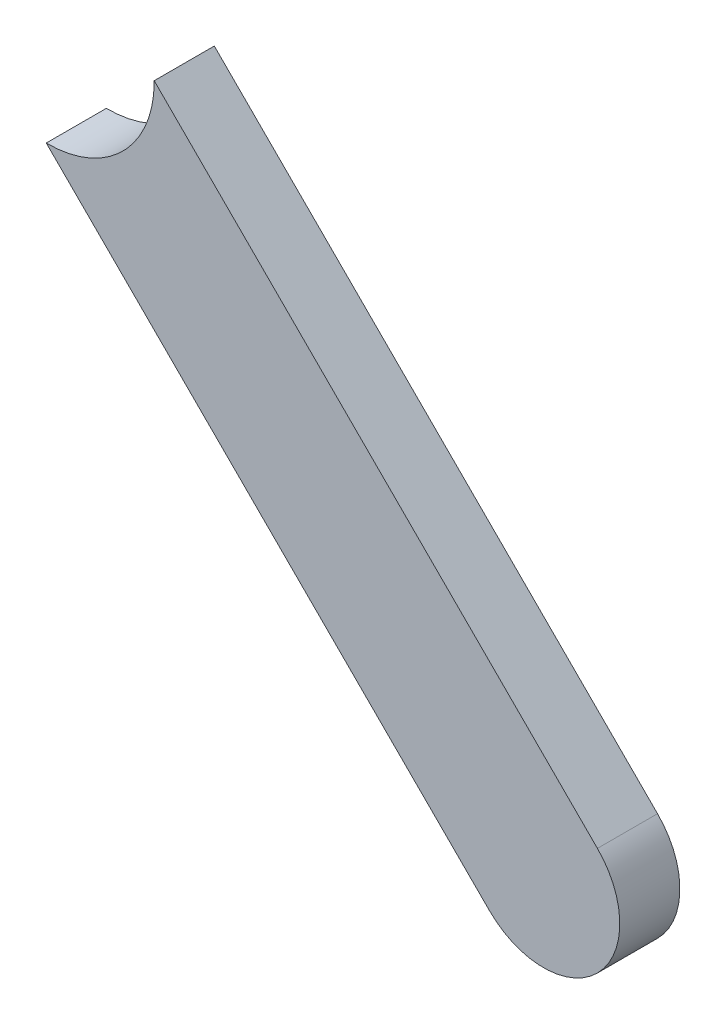
ISO-10303-21;
HEADER;
FILE_DESCRIPTION(('STEP AP214'),'2;1');
FILE_NAME('part.step','',(''),(''),'','','');
FILE_SCHEMA(('AUTOMOTIVE_DESIGN { 1 0 10303 214 1 1 1 1 }'));
ENDSEC;
DATA;
#1=APPLICATION_CONTEXT('core data for automotive mechanical design processes');
#2=APPLICATION_PROTOCOL_DEFINITION('international standard','automotive_design',2000,#1);
#3=PRODUCT_CONTEXT('',#1,'mechanical');
#4=PRODUCT('Part','Part','',(#3));
#5=PRODUCT_RELATED_PRODUCT_CATEGORY('part','',(#4));
#6=PRODUCT_DEFINITION_FORMATION('','',#4);
#7=PRODUCT_DEFINITION_CONTEXT('part definition',#1,'design');
#8=PRODUCT_DEFINITION('design','',#6,#7);
#9=PRODUCT_DEFINITION_SHAPE('','',#8);
#10=(LENGTH_UNIT() NAMED_UNIT(*) SI_UNIT(.MILLI.,.METRE.));
#11=(NAMED_UNIT(*) PLANE_ANGLE_UNIT() SI_UNIT($,.RADIAN.));
#12=(NAMED_UNIT(*) SI_UNIT($,.STERADIAN.) SOLID_ANGLE_UNIT());
#13=UNCERTAINTY_MEASURE_WITH_UNIT(LENGTH_MEASURE(1.E-05),#10,'distance_accuracy_value','');
#14=(GEOMETRIC_REPRESENTATION_CONTEXT(3) GLOBAL_UNCERTAINTY_ASSIGNED_CONTEXT((#13)) GLOBAL_UNIT_ASSIGNED_CONTEXT((#10,
#11,#12)) REPRESENTATION_CONTEXT('',''));
#15=CARTESIAN_POINT('',(0.,0.,0.));
#16=DIRECTION('',(0.,0.,1.));
#17=DIRECTION('',(1.,0.,0.));
#18=AXIS2_PLACEMENT_3D('',#15,#16,#17);
#19=CARTESIAN_POINT('',(134.108372153799,99.3394185062015,0.));
#20=DIRECTION('',(0.707106781186548,0.707106781186548,0.));
#21=DIRECTION('',(0.707106781186548,-0.707106781186548,0.));
#22=AXIS2_PLACEMENT_3D('',#19,#20,#21);
#23=PLANE('',#22);
#24=DIRECTION('',(0.707106781186548,-0.707106781186548,0.));
#25=VECTOR('',#24,1.);
#26=CARTESIAN_POINT('',(133.9323966,99.51539406,0.1999996));
#27=LINE('',#26,#25);
#28=CARTESIAN_POINT('',(134.108372153799,99.3394185062015,0.1999996));
#29=VERTEX_POINT('',#28);
#30=CARTESIAN_POINT('',(135.58339406,97.8643966,0.1999996));
#31=VERTEX_POINT('',#30);
#32=EDGE_CURVE('E11',#29,#31,#27,.T.);
#33=ORIENTED_EDGE('',*,*,#32,.F.);
#34=DIRECTION('',(0.,0.,1.));
#35=VECTOR('',#34,1.);
#36=CARTESIAN_POINT('',(134.108372153799,99.3394185062015,0.));
#37=LINE('',#36,#35);
#38=CARTESIAN_POINT('',(134.108372153799,99.3394185062015,0.));
#39=VERTEX_POINT('',#38);
#40=EDGE_CURVE('E24',#39,#29,#37,.T.);
#41=ORIENTED_EDGE('',*,*,#40,.F.);
#42=DIRECTION('',(0.707106781186548,-0.707106781186548,0.));
#43=VECTOR('',#42,1.);
#44=CARTESIAN_POINT('',(133.9323966,99.51539406,0.));
#45=LINE('',#44,#43);
#46=CARTESIAN_POINT('',(135.58339406,97.8643966,0.));
#47=VERTEX_POINT('',#46);
#48=EDGE_CURVE('E82',#39,#47,#45,.T.);
#49=ORIENTED_EDGE('',*,*,#48,.T.);
#50=DIRECTION('',(0.,0.,1.));
#51=VECTOR('',#50,1.);
#52=CARTESIAN_POINT('',(135.58339406,97.8643966,0.));
#53=LINE('',#52,#51);
#54=EDGE_CURVE('E37',#47,#31,#53,.T.);
#55=ORIENTED_EDGE('',*,*,#54,.T.);
#56=EDGE_LOOP('',(#33,#41,#49,#55));
#57=FACE_BOUND('',#56,.T.);
#58=ADVANCED_FACE('F17',(#57),#23,.F.);
#59=CARTESIAN_POINT('',(135.76299873,98.04400127,0.));
#60=DIRECTION('',(0.,0.,-1.));
#61=DIRECTION('',(-0.707106781186576,-0.70710678118652,0.));
#62=AXIS2_PLACEMENT_3D('',#59,#60,#61);
#63=CYLINDRICAL_SURFACE('',#62,0.253999360179539);
#64=CARTESIAN_POINT('',(135.76299873,98.04400127,0.1999996));
#65=DIRECTION('',(0.,0.,1.));
#66=DIRECTION('',(-0.707106781186576,-0.70710678118652,0.));
#67=AXIS2_PLACEMENT_3D('',#64,#65,#66);
#68=CIRCLE('',#67,0.253999360179539);
#69=CARTESIAN_POINT('',(135.9426034,98.22360594,0.1999996));
#70=VERTEX_POINT('',#69);
#71=EDGE_CURVE('E97',#31,#70,#68,.T.);
#72=ORIENTED_EDGE('',*,*,#71,.F.);
#73=ORIENTED_EDGE('',*,*,#54,.F.);
#74=CARTESIAN_POINT('',(135.76299873,98.04400127,0.));
#75=DIRECTION('',(0.,0.,1.));
#76=DIRECTION('',(-0.707106781186576,-0.70710678118652,0.));
#77=AXIS2_PLACEMENT_3D('',#74,#75,#76);
#78=CIRCLE('',#77,0.253999360179539);
#79=CARTESIAN_POINT('',(135.9426034,98.22360594,0.));
#80=VERTEX_POINT('',#79);
#81=EDGE_CURVE('E94',#47,#80,#78,.T.);
#82=ORIENTED_EDGE('',*,*,#81,.T.);
#83=DIRECTION('',(0.,0.,1.));
#84=VECTOR('',#83,1.);
#85=CARTESIAN_POINT('',(135.9426034,98.22360594,0.));
#86=LINE('',#85,#84);
#87=EDGE_CURVE('E92',#80,#70,#86,.T.);
#88=ORIENTED_EDGE('',*,*,#87,.T.);
#89=EDGE_LOOP('',(#72,#73,#82,#88));
#90=FACE_BOUND('',#89,.T.);
#91=ADVANCED_FACE('F103',(#90),#63,.T.);
#92=CARTESIAN_POINT('',(135.9426034,98.22360594,0.));
#93=DIRECTION('',(-0.707106781186548,-0.707106781186548,0.));
#94=DIRECTION('',(-0.707106781186548,0.707106781186548,0.));
#95=AXIS2_PLACEMENT_3D('',#92,#93,#94);
#96=PLANE('',#95);
#97=DIRECTION('',(-0.707106781186548,0.707106781186548,0.));
#98=VECTOR('',#97,1.);
#99=CARTESIAN_POINT('',(135.9426034,98.22360594,0.1999996));
#100=LINE('',#99,#98);
#101=CARTESIAN_POINT('',(134.467581493798,99.6986278462015,0.1999996));
#102=VERTEX_POINT('',#101);
#103=EDGE_CURVE('E89',#70,#102,#100,.T.);
#104=ORIENTED_EDGE('',*,*,#103,.F.);
#105=ORIENTED_EDGE('',*,*,#87,.F.);
#106=DIRECTION('',(-0.707106781186548,0.707106781186548,0.));
#107=VECTOR('',#106,1.);
#108=CARTESIAN_POINT('',(135.9426034,98.22360594,0.));
#109=LINE('',#108,#107);
#110=CARTESIAN_POINT('',(134.467581493798,99.6986278462015,0.));
#111=VERTEX_POINT('',#110);
#112=EDGE_CURVE('E87',#80,#111,#109,.T.);
#113=ORIENTED_EDGE('',*,*,#112,.T.);
#114=DIRECTION('',(0.,0.,1.));
#115=VECTOR('',#114,1.);
#116=CARTESIAN_POINT('',(134.467581493798,99.6986278462015,0.));
#117=LINE('',#116,#115);
#118=EDGE_CURVE('E69',#111,#102,#117,.T.);
#119=ORIENTED_EDGE('',*,*,#118,.T.);
#120=EDGE_LOOP('',(#104,#105,#113,#119));
#121=FACE_BOUND('',#120,.T.);
#122=ADVANCED_FACE('F108',(#121),#96,.F.);
#123=CARTESIAN_POINT('',(134.112,99.695,0.));
#124=DIRECTION('',(0.,0.,-1.));
#125=DIRECTION('',(1.,0.,0.));
#126=AXIS2_PLACEMENT_3D('',#123,#124,#125);
#127=CYLINDRICAL_SURFACE('',#126,0.3556);
#128=DIRECTION('',(0.,0.,1.));
#129=VECTOR('',#128,1.);
#130=CARTESIAN_POINT('',(134.4676,99.695,0.));
#131=LINE('',#130,#129);
#132=CARTESIAN_POINT('',(134.4676,99.695,0.));
#133=VERTEX_POINT('',#132);
#134=CARTESIAN_POINT('',(134.4676,99.695,0.1999996));
#135=VERTEX_POINT('',#134);
#136=EDGE_CURVE('E59',#133,#135,#131,.T.);
#137=ORIENTED_EDGE('',*,*,#136,.T.);
#138=CARTESIAN_POINT('',(134.112,99.695,0.1999996));
#139=DIRECTION('',(0.,0.,1.));
#140=DIRECTION('',(1.,0.,0.));
#141=AXIS2_PLACEMENT_3D('',#138,#139,#140);
#142=CIRCLE('',#141,0.3556);
#143=EDGE_CURVE('E70',#135,#102,#142,.T.);
#144=ORIENTED_EDGE('',*,*,#143,.T.);
#145=ORIENTED_EDGE('',*,*,#118,.F.);
#146=CARTESIAN_POINT('',(134.112,99.695,0.));
#147=DIRECTION('',(0.,0.,1.));
#148=DIRECTION('',(1.,0.,0.));
#149=AXIS2_PLACEMENT_3D('',#146,#147,#148);
#150=CIRCLE('',#149,0.3556);
#151=EDGE_CURVE('E73',#133,#111,#150,.T.);
#152=ORIENTED_EDGE('',*,*,#151,.F.);
#153=EDGE_LOOP('',(#137,#144,#145,#152));
#154=FACE_BOUND('',#153,.T.);
#155=ADVANCED_FACE('F74',(#154),#127,.F.);
#156=CARTESIAN_POINT('',(134.112,99.695,0.));
#157=DIRECTION('',(0.,0.,-1.));
#158=DIRECTION('',(1.,0.,0.));
#159=AXIS2_PLACEMENT_3D('',#156,#157,#158);
#160=CYLINDRICAL_SURFACE('',#159,0.3556);
#161=ORIENTED_EDGE('',*,*,#40,.T.);
#162=CARTESIAN_POINT('',(134.112,99.695,0.1999996));
#163=DIRECTION('',(0.,0.,1.));
#164=DIRECTION('',(1.,0.,0.));
#165=AXIS2_PLACEMENT_3D('',#162,#163,#164);
#166=CIRCLE('',#165,0.3556);
#167=EDGE_CURVE('E65',#29,#135,#166,.T.);
#168=ORIENTED_EDGE('',*,*,#167,.T.);
#169=ORIENTED_EDGE('',*,*,#136,.F.);
#170=EDGE_CURVE('E63',#39,#133,#150,.T.);
#171=ORIENTED_EDGE('',*,*,#170,.F.);
#172=EDGE_LOOP('',(#161,#168,#169,#171));
#173=FACE_BOUND('',#172,.T.);
#174=ADVANCED_FACE('F61',(#173),#160,.F.);
#175=CARTESIAN_POINT('',(133.9323966,99.51539406,0.));
#176=DIRECTION('',(0.,0.,-1.));
#177=DIRECTION('',(-1.,0.,0.));
#178=AXIS2_PLACEMENT_3D('',#175,#176,#177);
#179=PLANE('',#178);
#180=ORIENTED_EDGE('',*,*,#48,.F.);
#181=ORIENTED_EDGE('',*,*,#170,.T.);
#182=ORIENTED_EDGE('',*,*,#151,.T.);
#183=ORIENTED_EDGE('',*,*,#112,.F.);
#184=ORIENTED_EDGE('',*,*,#81,.F.);
#185=EDGE_LOOP('',(#180,#181,#182,#183,#184));
#186=FACE_BOUND('',#185,.T.);
#187=ADVANCED_FACE('F80',(#186),#179,.T.);
#188=CARTESIAN_POINT('',(133.9323966,99.51539406,0.1999996));
#189=DIRECTION('',(0.,0.,-1.));
#190=DIRECTION('',(-1.,0.,0.));
#191=AXIS2_PLACEMENT_3D('',#188,#189,#190);
#192=PLANE('',#191);
#193=ORIENTED_EDGE('',*,*,#167,.F.);
#194=ORIENTED_EDGE('',*,*,#32,.T.);
#195=ORIENTED_EDGE('',*,*,#71,.T.);
#196=ORIENTED_EDGE('',*,*,#103,.T.);
#197=ORIENTED_EDGE('',*,*,#143,.F.);
#198=EDGE_LOOP('',(#193,#194,#195,#196,#197));
#199=FACE_BOUND('',#198,.T.);
#200=ADVANCED_FACE('F106',(#199),#192,.F.);
#201=CLOSED_SHELL('',(#58,#91,#122,#155,#174,#187,#200));
#202=MANIFOLD_SOLID_BREP('B1',#201);
#203=ADVANCED_BREP_SHAPE_REPRESENTATION('',(#18,#202),#14);
#204=SHAPE_DEFINITION_REPRESENTATION(#9,#203);
ENDSEC;
END-ISO-10303-21;
